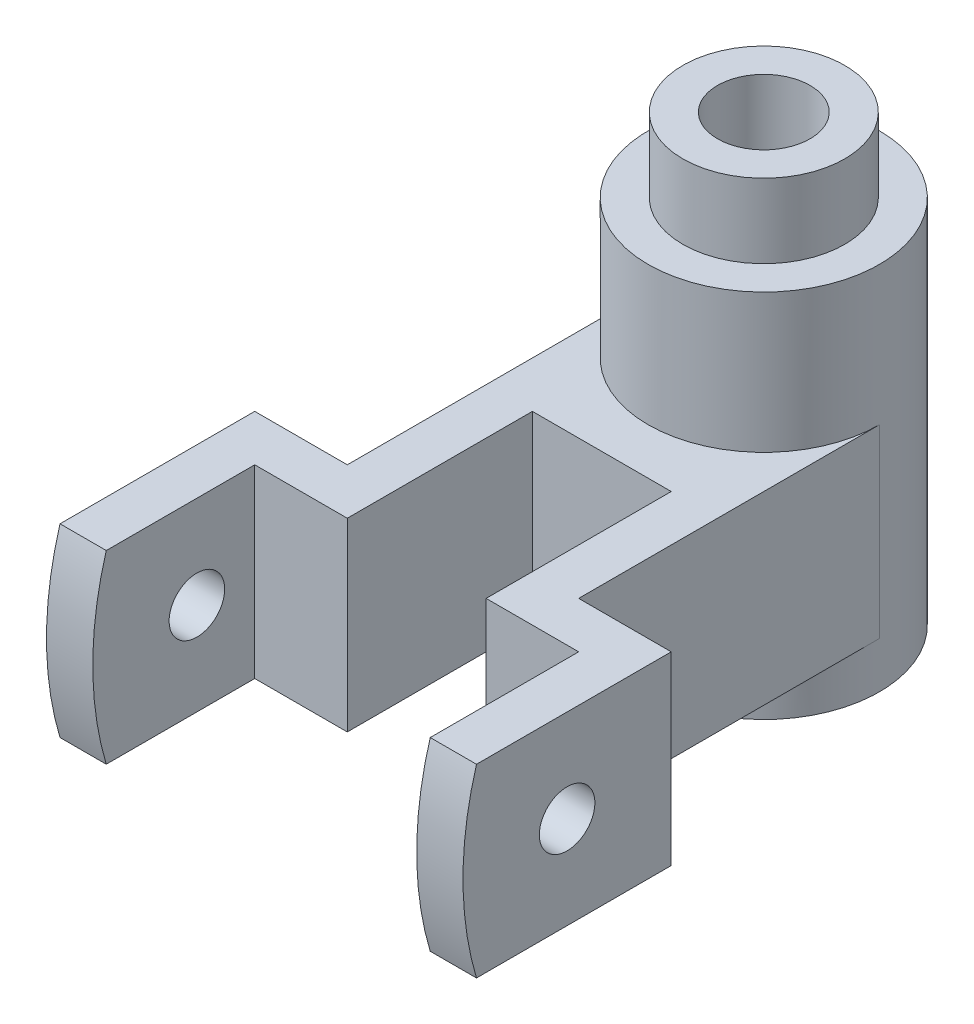
ISO-10303-21;
HEADER;
FILE_DESCRIPTION(('STEP AP214'),'2;1');
FILE_NAME('part.step','',(''),(''),'','','');
FILE_SCHEMA(('AUTOMOTIVE_DESIGN { 1 0 10303 214 1 1 1 1 }'));
ENDSEC;
DATA;
#1=APPLICATION_CONTEXT('core data for automotive mechanical design processes');
#2=APPLICATION_PROTOCOL_DEFINITION('international standard','automotive_design',2000,#1);
#3=PRODUCT_CONTEXT('',#1,'mechanical');
#4=PRODUCT('Part','Part','',(#3));
#5=PRODUCT_RELATED_PRODUCT_CATEGORY('part','',(#4));
#6=PRODUCT_DEFINITION_FORMATION('','',#4);
#7=PRODUCT_DEFINITION_CONTEXT('part definition',#1,'design');
#8=PRODUCT_DEFINITION('design','',#6,#7);
#9=PRODUCT_DEFINITION_SHAPE('','',#8);
#10=(LENGTH_UNIT() NAMED_UNIT(*) SI_UNIT(.MILLI.,.METRE.));
#11=(NAMED_UNIT(*) PLANE_ANGLE_UNIT() SI_UNIT($,.RADIAN.));
#12=(NAMED_UNIT(*) SI_UNIT($,.STERADIAN.) SOLID_ANGLE_UNIT());
#13=UNCERTAINTY_MEASURE_WITH_UNIT(LENGTH_MEASURE(1.E-05),#10,'distance_accuracy_value','');
#14=(GEOMETRIC_REPRESENTATION_CONTEXT(3) GLOBAL_UNCERTAINTY_ASSIGNED_CONTEXT((#13)) GLOBAL_UNIT_ASSIGNED_CONTEXT((#10,
#11,#12)) REPRESENTATION_CONTEXT('',''));
#15=CARTESIAN_POINT('',(0.,0.,0.));
#16=DIRECTION('',(0.,0.,1.));
#17=DIRECTION('',(1.,0.,0.));
#18=AXIS2_PLACEMENT_3D('',#15,#16,#17);
#19=CARTESIAN_POINT('',(45.,0.,75.));
#20=DIRECTION('',(-1.,0.,0.));
#21=DIRECTION('',(0.,0.,1.));
#22=AXIS2_PLACEMENT_3D('',#19,#20,#21);
#23=PLANE('',#22);
#24=CARTESIAN_POINT('',(45.,30.,87.5));
#25=DIRECTION('',(-1.,0.,0.));
#26=DIRECTION('',(0.,0.,1.));
#27=AXIS2_PLACEMENT_3D('',#24,#25,#26);
#28=CIRCLE('',#27,6.);
#29=CARTESIAN_POINT('',(45.,30.,93.5));
#30=VERTEX_POINT('',#29);
#31=EDGE_CURVE('E172',#30,#30,#28,.F.);
#32=ORIENTED_EDGE('',*,*,#31,.F.);
#33=EDGE_LOOP('',(#32));
#34=FACE_BOUND('',#33,.T.);
#35=CARTESIAN_POINT('',(45.,30.,40.));
#36=DIRECTION('',(-1.,0.,0.));
#37=DIRECTION('',(0.,0.,1.));
#38=AXIS2_PLACEMENT_3D('',#35,#36,#37);
#39=CIRCLE('',#38,70.);
#40=CARTESIAN_POINT('',(45.,50.,107.082039324994));
#41=VERTEX_POINT('',#40);
#42=CARTESIAN_POINT('',(45.,10.,107.082039324994));
#43=VERTEX_POINT('',#42);
#44=EDGE_CURVE('E184',#41,#43,#39,.F.);
#45=ORIENTED_EDGE('',*,*,#44,.T.);
#46=DIRECTION('',(0.,0.,-1.));
#47=VECTOR('',#46,1.);
#48=CARTESIAN_POINT('',(45.,10.,75.));
#49=LINE('',#48,#47);
#50=CARTESIAN_POINT('',(45.,10.,65.));
#51=VERTEX_POINT('',#50);
#52=EDGE_CURVE('E176',#43,#51,#49,.T.);
#53=ORIENTED_EDGE('',*,*,#52,.T.);
#54=DIRECTION('',(0.,1.,0.));
#55=VECTOR('',#54,1.);
#56=CARTESIAN_POINT('',(45.,0.,65.));
#57=LINE('',#56,#55);
#58=CARTESIAN_POINT('',(45.,50.,65.));
#59=VERTEX_POINT('',#58);
#60=EDGE_CURVE('E223',#51,#59,#57,.T.);
#61=ORIENTED_EDGE('',*,*,#60,.T.);
#62=DIRECTION('',(0.,0.,-1.));
#63=VECTOR('',#62,1.);
#64=CARTESIAN_POINT('',(45.,50.,75.));
#65=LINE('',#64,#63);
#66=EDGE_CURVE('E221',#41,#59,#65,.T.);
#67=ORIENTED_EDGE('',*,*,#66,.F.);
#68=EDGE_LOOP('',(#45,#53,#61,#67));
#69=FACE_BOUND('',#68,.T.);
#70=ADVANCED_FACE('F39',(#34,#69),#23,.F.);
#71=CARTESIAN_POINT('',(35.,50.,110.));
#72=DIRECTION('',(-1.,0.,0.));
#73=DIRECTION('',(0.,-1.,0.));
#74=AXIS2_PLACEMENT_3D('',#71,#72,#73);
#75=PLANE('',#74);
#76=CARTESIAN_POINT('',(35.,30.,87.5));
#77=DIRECTION('',(1.,0.,0.));
#78=DIRECTION('',(0.,1.,0.));
#79=AXIS2_PLACEMENT_3D('',#76,#77,#78);
#80=CIRCLE('',#79,6.);
#81=CARTESIAN_POINT('',(35.,36.,87.5));
#82=VERTEX_POINT('',#81);
#83=EDGE_CURVE('E177',#82,#82,#80,.T.);
#84=ORIENTED_EDGE('',*,*,#83,.T.);
#85=EDGE_LOOP('',(#84));
#86=FACE_BOUND('',#85,.T.);
#87=DIRECTION('',(0.,0.,-1.));
#88=VECTOR('',#87,1.);
#89=CARTESIAN_POINT('',(35.,10.,110.));
#90=LINE('',#89,#88);
#91=CARTESIAN_POINT('',(35.,10.,107.082039324994));
#92=VERTEX_POINT('',#91);
#93=CARTESIAN_POINT('',(35.,10.,75.));
#94=VERTEX_POINT('',#93);
#95=EDGE_CURVE('E62',#92,#94,#90,.T.);
#96=ORIENTED_EDGE('',*,*,#95,.F.);
#97=CARTESIAN_POINT('',(35.,30.,40.));
#98=DIRECTION('',(1.,0.,0.));
#99=DIRECTION('',(0.,1.,0.));
#100=AXIS2_PLACEMENT_3D('',#97,#98,#99);
#101=CIRCLE('',#100,70.);
#102=CARTESIAN_POINT('',(35.,50.,107.082039324994));
#103=VERTEX_POINT('',#102);
#104=EDGE_CURVE('E166',#103,#92,#101,.T.);
#105=ORIENTED_EDGE('',*,*,#104,.F.);
#106=DIRECTION('',(0.,0.,-1.));
#107=VECTOR('',#106,1.);
#108=CARTESIAN_POINT('',(35.,50.,110.));
#109=LINE('',#108,#107);
#110=CARTESIAN_POINT('',(35.,50.,75.));
#111=VERTEX_POINT('',#110);
#112=EDGE_CURVE('E54',#103,#111,#109,.T.);
#113=ORIENTED_EDGE('',*,*,#112,.T.);
#114=DIRECTION('',(0.,1.,0.));
#115=VECTOR('',#114,1.);
#116=CARTESIAN_POINT('',(35.,50.,75.));
#117=LINE('',#116,#115);
#118=EDGE_CURVE('E180',#94,#111,#117,.T.);
#119=ORIENTED_EDGE('',*,*,#118,.F.);
#120=EDGE_LOOP('',(#96,#105,#113,#119));
#121=FACE_BOUND('',#120,.T.);
#122=ADVANCED_FACE('F179',(#86,#121),#75,.T.);
#123=CARTESIAN_POINT('',(-45.,0.,75.));
#124=DIRECTION('',(-1.,0.,0.));
#125=DIRECTION('',(0.,0.,1.));
#126=AXIS2_PLACEMENT_3D('',#123,#124,#125);
#127=PLANE('',#126);
#128=CARTESIAN_POINT('',(-45.,30.,87.5));
#129=DIRECTION('',(-1.,0.,0.));
#130=DIRECTION('',(0.,0.,1.));
#131=AXIS2_PLACEMENT_3D('',#128,#129,#130);
#132=CIRCLE('',#131,6.);
#133=CARTESIAN_POINT('',(-45.,30.,93.5));
#134=VERTEX_POINT('',#133);
#135=EDGE_CURVE('E191',#134,#134,#132,.T.);
#136=ORIENTED_EDGE('',*,*,#135,.F.);
#137=EDGE_LOOP('',(#136));
#138=FACE_BOUND('',#137,.T.);
#139=DIRECTION('',(0.,0.,-1.));
#140=VECTOR('',#139,1.);
#141=CARTESIAN_POINT('',(-45.,10.,75.));
#142=LINE('',#141,#140);
#143=CARTESIAN_POINT('',(-45.,10.,107.082039324994));
#144=VERTEX_POINT('',#143);
#145=CARTESIAN_POINT('',(-45.,10.,65.));
#146=VERTEX_POINT('',#145);
#147=EDGE_CURVE('E239',#144,#146,#142,.T.);
#148=ORIENTED_EDGE('',*,*,#147,.F.);
#149=CARTESIAN_POINT('',(-45.,30.,40.));
#150=DIRECTION('',(-1.,0.,0.));
#151=DIRECTION('',(0.,0.,1.));
#152=AXIS2_PLACEMENT_3D('',#149,#150,#151);
#153=CIRCLE('',#152,70.);
#154=CARTESIAN_POINT('',(-45.,50.,107.082039324994));
#155=VERTEX_POINT('',#154);
#156=EDGE_CURVE('E201',#144,#155,#153,.T.);
#157=ORIENTED_EDGE('',*,*,#156,.T.);
#158=DIRECTION('',(0.,0.,-1.));
#159=VECTOR('',#158,1.);
#160=CARTESIAN_POINT('',(-45.,50.,75.));
#161=LINE('',#160,#159);
#162=CARTESIAN_POINT('',(-45.,50.,65.));
#163=VERTEX_POINT('',#162);
#164=EDGE_CURVE('E247',#155,#163,#161,.T.);
#165=ORIENTED_EDGE('',*,*,#164,.T.);
#166=DIRECTION('',(0.,1.,0.));
#167=VECTOR('',#166,1.);
#168=CARTESIAN_POINT('',(-45.,0.,65.));
#169=LINE('',#168,#167);
#170=EDGE_CURVE('E234',#146,#163,#169,.T.);
#171=ORIENTED_EDGE('',*,*,#170,.F.);
#172=EDGE_LOOP('',(#148,#157,#165,#171));
#173=FACE_BOUND('',#172,.T.);
#174=ADVANCED_FACE('F359',(#138,#173),#127,.T.);
#175=CARTESIAN_POINT('',(-35.,50.,110.));
#176=DIRECTION('',(-1.,0.,0.));
#177=DIRECTION('',(0.,-1.,0.));
#178=AXIS2_PLACEMENT_3D('',#175,#176,#177);
#179=PLANE('',#178);
#180=CARTESIAN_POINT('',(-35.,30.,87.5));
#181=DIRECTION('',(1.,0.,0.));
#182=DIRECTION('',(0.,1.,0.));
#183=AXIS2_PLACEMENT_3D('',#180,#181,#182);
#184=CIRCLE('',#183,6.);
#185=CARTESIAN_POINT('',(-35.,36.,87.5));
#186=VERTEX_POINT('',#185);
#187=EDGE_CURVE('E182',#186,#186,#184,.T.);
#188=ORIENTED_EDGE('',*,*,#187,.F.);
#189=EDGE_LOOP('',(#188));
#190=FACE_BOUND('',#189,.T.);
#191=CARTESIAN_POINT('',(-35.,30.,40.));
#192=DIRECTION('',(1.,0.,0.));
#193=DIRECTION('',(0.,1.,0.));
#194=AXIS2_PLACEMENT_3D('',#191,#192,#193);
#195=CIRCLE('',#194,70.);
#196=CARTESIAN_POINT('',(-35.,50.,107.082039324994));
#197=VERTEX_POINT('',#196);
#198=CARTESIAN_POINT('',(-35.,10.,107.082039324994));
#199=VERTEX_POINT('',#198);
#200=EDGE_CURVE('E196',#197,#199,#195,.T.);
#201=ORIENTED_EDGE('',*,*,#200,.T.);
#202=DIRECTION('',(0.,0.,-1.));
#203=VECTOR('',#202,1.);
#204=CARTESIAN_POINT('',(-35.,10.,110.));
#205=LINE('',#204,#203);
#206=CARTESIAN_POINT('',(-35.,10.,75.));
#207=VERTEX_POINT('',#206);
#208=EDGE_CURVE('E209',#199,#207,#205,.T.);
#209=ORIENTED_EDGE('',*,*,#208,.T.);
#210=DIRECTION('',(0.,1.,0.));
#211=VECTOR('',#210,1.);
#212=CARTESIAN_POINT('',(-35.,50.,75.));
#213=LINE('',#212,#211);
#214=CARTESIAN_POINT('',(-35.,50.,75.));
#215=VERTEX_POINT('',#214);
#216=EDGE_CURVE('E204',#207,#215,#213,.T.);
#217=ORIENTED_EDGE('',*,*,#216,.T.);
#218=DIRECTION('',(0.,0.,-1.));
#219=VECTOR('',#218,1.);
#220=CARTESIAN_POINT('',(-35.,50.,110.));
#221=LINE('',#220,#219);
#222=EDGE_CURVE('E207',#197,#215,#221,.T.);
#223=ORIENTED_EDGE('',*,*,#222,.F.);
#224=EDGE_LOOP('',(#201,#209,#217,#223));
#225=FACE_BOUND('',#224,.T.);
#226=ADVANCED_FACE('F377',(#190,#225),#179,.F.);
#227=CARTESIAN_POINT('',(0.,10.,0.));
#228=DIRECTION('',(0.,1.,0.));
#229=DIRECTION('',(0.,0.,1.));
#230=AXIS2_PLACEMENT_3D('',#227,#228,#229);
#231=PLANE('',#230);
#232=ORIENTED_EDGE('',*,*,#52,.F.);
#233=DIRECTION('',(-1.,0.,0.));
#234=VECTOR('',#233,1.);
#235=CARTESIAN_POINT('',(70.,10.,107.082039324994));
#236=LINE('',#235,#234);
#237=EDGE_CURVE('E168',#43,#92,#236,.T.);
#238=ORIENTED_EDGE('',*,*,#237,.T.);
#239=ORIENTED_EDGE('',*,*,#95,.T.);
#240=DIRECTION('',(1.,0.,0.));
#241=VECTOR('',#240,1.);
#242=CARTESIAN_POINT('',(0.,10.,75.));
#243=LINE('',#242,#241);
#244=CARTESIAN_POINT('',(15.,10.,75.));
#245=VERTEX_POINT('',#244);
#246=EDGE_CURVE('E212',#245,#94,#243,.T.);
#247=ORIENTED_EDGE('',*,*,#246,.F.);
#248=DIRECTION('',(0.,0.,1.));
#249=VECTOR('',#248,1.);
#250=CARTESIAN_POINT('',(15.,10.,0.));
#251=LINE('',#250,#249);
#252=CARTESIAN_POINT('',(15.,10.,35.));
#253=VERTEX_POINT('',#252);
#254=EDGE_CURVE('E256',#253,#245,#251,.T.);
#255=ORIENTED_EDGE('',*,*,#254,.F.);
#256=DIRECTION('',(-1.,0.,0.));
#257=VECTOR('',#256,1.);
#258=CARTESIAN_POINT('',(0.,10.,35.));
#259=LINE('',#258,#257);
#260=CARTESIAN_POINT('',(-15.,10.,35.));
#261=VERTEX_POINT('',#260);
#262=EDGE_CURVE('E253',#253,#261,#259,.T.);
#263=ORIENTED_EDGE('',*,*,#262,.T.);
#264=DIRECTION('',(0.,0.,1.));
#265=VECTOR('',#264,1.);
#266=CARTESIAN_POINT('',(-15.,10.,0.));
#267=LINE('',#266,#265);
#268=CARTESIAN_POINT('',(-15.,10.,75.));
#269=VERTEX_POINT('',#268);
#270=EDGE_CURVE('E250',#261,#269,#267,.T.);
#271=ORIENTED_EDGE('',*,*,#270,.T.);
#272=DIRECTION('',(1.,0.,0.));
#273=VECTOR('',#272,1.);
#274=CARTESIAN_POINT('',(0.,10.,75.));
#275=LINE('',#274,#273);
#276=EDGE_CURVE('E231',#207,#269,#275,.T.);
#277=ORIENTED_EDGE('',*,*,#276,.F.);
#278=ORIENTED_EDGE('',*,*,#208,.F.);
#279=DIRECTION('',(1.,0.,0.));
#280=VECTOR('',#279,1.);
#281=CARTESIAN_POINT('',(-70.,10.,107.082039324994));
#282=LINE('',#281,#280);
#283=EDGE_CURVE('E188',#144,#199,#282,.T.);
#284=ORIENTED_EDGE('',*,*,#283,.F.);
#285=ORIENTED_EDGE('',*,*,#147,.T.);
#286=DIRECTION('',(1.,0.,0.));
#287=VECTOR('',#286,1.);
#288=CARTESIAN_POINT('',(0.,10.,65.));
#289=LINE('',#288,#287);
#290=CARTESIAN_POINT('',(-25.,10.,65.));
#291=VERTEX_POINT('',#290);
#292=EDGE_CURVE('E230',#146,#291,#289,.T.);
#293=ORIENTED_EDGE('',*,*,#292,.T.);
#294=DIRECTION('',(0.,0.,1.));
#295=VECTOR('',#294,1.);
#296=CARTESIAN_POINT('',(-25.,10.,0.));
#297=LINE('',#296,#295);
#298=CARTESIAN_POINT('',(-25.,10.,0.));
#299=VERTEX_POINT('',#298);
#300=EDGE_CURVE('E264',#299,#291,#297,.T.);
#301=ORIENTED_EDGE('',*,*,#300,.F.);
#302=CARTESIAN_POINT('',(0.,9.99999999999999,0.));
#303=DIRECTION('',(0.,1.,0.));
#304=DIRECTION('',(0.,0.,1.));
#305=AXIS2_PLACEMENT_3D('',#302,#303,#304);
#306=CIRCLE('',#305,25.);
#307=CARTESIAN_POINT('',(25.,10.,0.));
#308=VERTEX_POINT('',#307);
#309=EDGE_CURVE('E300',#299,#308,#306,.T.);
#310=ORIENTED_EDGE('',*,*,#309,.T.);
#311=DIRECTION('',(0.,0.,1.));
#312=VECTOR('',#311,1.);
#313=CARTESIAN_POINT('',(25.,10.,0.));
#314=LINE('',#313,#312);
#315=CARTESIAN_POINT('',(25.,10.,65.));
#316=VERTEX_POINT('',#315);
#317=EDGE_CURVE('E258',#308,#316,#314,.T.);
#318=ORIENTED_EDGE('',*,*,#317,.T.);
#319=DIRECTION('',(1.,0.,0.));
#320=VECTOR('',#319,1.);
#321=CARTESIAN_POINT('',(0.,10.,65.));
#322=LINE('',#321,#320);
#323=EDGE_CURVE('E211',#316,#51,#322,.T.);
#324=ORIENTED_EDGE('',*,*,#323,.T.);
#325=EDGE_LOOP('',(#232,#238,#239,#247,#255,#263,#271,#277,#278,#284,#285,#293,#301,#310,#318,#324));
#326=FACE_BOUND('',#325,.T.);
#327=ADVANCED_FACE('F174',(#326),#231,.F.);
#328=CARTESIAN_POINT('',(0.,50.,0.));
#329=DIRECTION('',(0.,1.,0.));
#330=DIRECTION('',(0.,0.,1.));
#331=AXIS2_PLACEMENT_3D('',#328,#329,#330);
#332=PLANE('',#331);
#333=DIRECTION('',(-1.,0.,0.));
#334=VECTOR('',#333,1.);
#335=CARTESIAN_POINT('',(70.,50.,107.082039324994));
#336=LINE('',#335,#334);
#337=EDGE_CURVE('E171',#41,#103,#336,.T.);
#338=ORIENTED_EDGE('',*,*,#337,.F.);
#339=ORIENTED_EDGE('',*,*,#66,.T.);
#340=DIRECTION('',(1.,0.,0.));
#341=VECTOR('',#340,1.);
#342=CARTESIAN_POINT('',(0.,50.,65.));
#343=LINE('',#342,#341);
#344=CARTESIAN_POINT('',(25.,50.,65.));
#345=VERTEX_POINT('',#344);
#346=EDGE_CURVE('E215',#345,#59,#343,.T.);
#347=ORIENTED_EDGE('',*,*,#346,.F.);
#348=DIRECTION('',(0.,0.,1.));
#349=VECTOR('',#348,1.);
#350=CARTESIAN_POINT('',(25.,50.,0.));
#351=LINE('',#350,#349);
#352=CARTESIAN_POINT('',(25.,50.,0.));
#353=VERTEX_POINT('',#352);
#354=EDGE_CURVE('E274',#353,#345,#351,.T.);
#355=ORIENTED_EDGE('',*,*,#354,.F.);
#356=CARTESIAN_POINT('',(0.,50.,0.));
#357=DIRECTION('',(0.,1.,0.));
#358=DIRECTION('',(0.,0.,1.));
#359=AXIS2_PLACEMENT_3D('',#356,#357,#358);
#360=CIRCLE('',#359,25.);
#361=CARTESIAN_POINT('',(-25.,50.,0.));
#362=VERTEX_POINT('',#361);
#363=EDGE_CURVE('E285',#362,#353,#360,.T.);
#364=ORIENTED_EDGE('',*,*,#363,.F.);
#365=DIRECTION('',(0.,0.,1.));
#366=VECTOR('',#365,1.);
#367=CARTESIAN_POINT('',(-25.,50.,0.));
#368=LINE('',#367,#366);
#369=CARTESIAN_POINT('',(-25.,50.,65.));
#370=VERTEX_POINT('',#369);
#371=EDGE_CURVE('E254',#362,#370,#368,.T.);
#372=ORIENTED_EDGE('',*,*,#371,.T.);
#373=DIRECTION('',(1.,0.,0.));
#374=VECTOR('',#373,1.);
#375=CARTESIAN_POINT('',(0.,50.,65.));
#376=LINE('',#375,#374);
#377=EDGE_CURVE('E242',#163,#370,#376,.T.);
#378=ORIENTED_EDGE('',*,*,#377,.F.);
#379=ORIENTED_EDGE('',*,*,#164,.F.);
#380=DIRECTION('',(1.,0.,0.));
#381=VECTOR('',#380,1.);
#382=CARTESIAN_POINT('',(-70.,50.,107.082039324994));
#383=LINE('',#382,#381);
#384=EDGE_CURVE('E198',#155,#197,#383,.T.);
#385=ORIENTED_EDGE('',*,*,#384,.T.);
#386=ORIENTED_EDGE('',*,*,#222,.T.);
#387=DIRECTION('',(1.,0.,0.));
#388=VECTOR('',#387,1.);
#389=CARTESIAN_POINT('',(0.,50.,75.));
#390=LINE('',#389,#388);
#391=CARTESIAN_POINT('',(-15.,50.,75.));
#392=VERTEX_POINT('',#391);
#393=EDGE_CURVE('E237',#215,#392,#390,.T.);
#394=ORIENTED_EDGE('',*,*,#393,.T.);
#395=DIRECTION('',(0.,0.,1.));
#396=VECTOR('',#395,1.);
#397=CARTESIAN_POINT('',(-15.,50.,0.));
#398=LINE('',#397,#396);
#399=CARTESIAN_POINT('',(-15.,50.,35.));
#400=VERTEX_POINT('',#399);
#401=EDGE_CURVE('E249',#400,#392,#398,.T.);
#402=ORIENTED_EDGE('',*,*,#401,.F.);
#403=DIRECTION('',(-1.,0.,0.));
#404=VECTOR('',#403,1.);
#405=CARTESIAN_POINT('',(0.,50.,35.));
#406=LINE('',#405,#404);
#407=CARTESIAN_POINT('',(15.,50.,35.));
#408=VERTEX_POINT('',#407);
#409=EDGE_CURVE('E270',#408,#400,#406,.T.);
#410=ORIENTED_EDGE('',*,*,#409,.F.);
#411=DIRECTION('',(0.,0.,1.));
#412=VECTOR('',#411,1.);
#413=CARTESIAN_POINT('',(15.,50.,0.));
#414=LINE('',#413,#412);
#415=CARTESIAN_POINT('',(15.,50.,75.));
#416=VERTEX_POINT('',#415);
#417=EDGE_CURVE('E272',#408,#416,#414,.T.);
#418=ORIENTED_EDGE('',*,*,#417,.T.);
#419=DIRECTION('',(1.,0.,0.));
#420=VECTOR('',#419,1.);
#421=CARTESIAN_POINT('',(0.,50.,75.));
#422=LINE('',#421,#420);
#423=EDGE_CURVE('E214',#416,#111,#422,.T.);
#424=ORIENTED_EDGE('',*,*,#423,.T.);
#425=ORIENTED_EDGE('',*,*,#112,.F.);
#426=EDGE_LOOP('',(#338,#339,#347,#355,#364,#372,#378,#379,#385,#386,#394,#402,#410,#418,#424,#425));
#427=FACE_BOUND('',#426,.T.);
#428=ADVANCED_FACE('F339',(#427),#332,.T.);
#429=CARTESIAN_POINT('',(0.,0.,75.));
#430=DIRECTION('',(0.,0.,1.));
#431=DIRECTION('',(1.,0.,0.));
#432=AXIS2_PLACEMENT_3D('',#429,#430,#431);
#433=PLANE('',#432);
#434=ORIENTED_EDGE('',*,*,#393,.F.);
#435=ORIENTED_EDGE('',*,*,#216,.F.);
#436=ORIENTED_EDGE('',*,*,#276,.T.);
#437=DIRECTION('',(0.,1.,0.));
#438=VECTOR('',#437,1.);
#439=CARTESIAN_POINT('',(-15.,0.,75.));
#440=LINE('',#439,#438);
#441=EDGE_CURVE('E233',#269,#392,#440,.T.);
#442=ORIENTED_EDGE('',*,*,#441,.T.);
#443=EDGE_LOOP('',(#434,#435,#436,#442));
#444=FACE_BOUND('',#443,.T.);
#445=ADVANCED_FACE('F350',(#444),#433,.T.);
#446=CARTESIAN_POINT('',(0.,80.,0.));
#447=DIRECTION('',(0.,-1.,0.));
#448=DIRECTION('',(0.,0.,-1.));
#449=AXIS2_PLACEMENT_3D('',#446,#447,#448);
#450=CYLINDRICAL_SURFACE('',#449,25.);
#451=CARTESIAN_POINT('',(0.,0.,0.));
#452=DIRECTION('',(0.,1.,0.));
#453=DIRECTION('',(0.,0.,1.));
#454=AXIS2_PLACEMENT_3D('',#451,#452,#453);
#455=CIRCLE('',#454,25.);
#456=CARTESIAN_POINT('',(0.,0.,25.));
#457=VERTEX_POINT('',#456);
#458=EDGE_CURVE('E311',#457,#457,#455,.T.);
#459=ORIENTED_EDGE('',*,*,#458,.T.);
#460=EDGE_LOOP('',(#459));
#461=FACE_BOUND('',#460,.T.);
#462=CARTESIAN_POINT('',(0.,80.,0.));
#463=DIRECTION('',(0.,1.,0.));
#464=DIRECTION('',(0.,0.,1.));
#465=AXIS2_PLACEMENT_3D('',#462,#463,#464);
#466=CIRCLE('',#465,25.);
#467=CARTESIAN_POINT('',(0.,80.,25.));
#468=VERTEX_POINT('',#467);
#469=EDGE_CURVE('E316',#468,#468,#466,.T.);
#470=ORIENTED_EDGE('',*,*,#469,.F.);
#471=EDGE_LOOP('',(#470));
#472=FACE_BOUND('',#471,.T.);
#473=ORIENTED_EDGE('',*,*,#309,.F.);
#474=DIRECTION('',(0.,1.,0.));
#475=VECTOR('',#474,1.);
#476=CARTESIAN_POINT('',(-25.,10.,0.));
#477=LINE('',#476,#475);
#478=EDGE_CURVE('E286',#299,#362,#477,.T.);
#479=ORIENTED_EDGE('',*,*,#478,.T.);
#480=ORIENTED_EDGE('',*,*,#363,.T.);
#481=DIRECTION('',(0.,1.,0.));
#482=VECTOR('',#481,1.);
#483=CARTESIAN_POINT('',(25.,10.,0.));
#484=LINE('',#483,#482);
#485=EDGE_CURVE('E289',#308,#353,#484,.T.);
#486=ORIENTED_EDGE('',*,*,#485,.F.);
#487=EDGE_LOOP('',(#473,#479,#480,#486));
#488=FACE_BOUND('',#487,.T.);
#489=ADVANCED_FACE('F41',(#461,#472,#488),#450,.T.);
#490=CARTESIAN_POINT('',(0.,-48.,0.));
#491=DIRECTION('',(0.,1.,0.));
#492=DIRECTION('',(0.,0.,1.));
#493=AXIS2_PLACEMENT_3D('',#490,#491,#492);
#494=CYLINDRICAL_SURFACE('',#493,10.);
#495=CARTESIAN_POINT('',(0.,0.,0.));
#496=DIRECTION('',(0.,1.,0.));
#497=DIRECTION('',(0.,0.,1.));
#498=AXIS2_PLACEMENT_3D('',#495,#496,#497);
#499=CIRCLE('',#498,10.);
#500=CARTESIAN_POINT('',(0.,0.,10.));
#501=VERTEX_POINT('',#500);
#502=EDGE_CURVE('E305',#501,#501,#499,.T.);
#503=ORIENTED_EDGE('',*,*,#502,.F.);
#504=EDGE_LOOP('',(#503));
#505=FACE_BOUND('',#504,.T.);
#506=CARTESIAN_POINT('',(0.,96.,0.));
#507=DIRECTION('',(0.,1.,0.));
#508=DIRECTION('',(0.,0.,1.));
#509=AXIS2_PLACEMENT_3D('',#506,#507,#508);
#510=CIRCLE('',#509,10.);
#511=CARTESIAN_POINT('',(0.,96.,10.));
#512=VERTEX_POINT('',#511);
#513=EDGE_CURVE('E302',#512,#512,#510,.T.);
#514=ORIENTED_EDGE('',*,*,#513,.T.);
#515=EDGE_LOOP('',(#514));
#516=FACE_BOUND('',#515,.T.);
#517=CARTESIAN_POINT('',(0.,10.,0.));
#518=DIRECTION('',(0.,1.,0.));
#519=DIRECTION('',(0.,0.,1.));
#520=AXIS2_PLACEMENT_3D('',#517,#518,#519);
#521=CIRCLE('',#520,10.);
#522=CARTESIAN_POINT('',(10.,10.,0.));
#523=VERTEX_POINT('',#522);
#524=CARTESIAN_POINT('',(-10.,10.,0.));
#525=VERTEX_POINT('',#524);
#526=EDGE_CURVE('E11',#523,#525,#521,.F.);
#527=ORIENTED_EDGE('',*,*,#526,.F.);
#528=DIRECTION('',(0.,1.,0.));
#529=VECTOR('',#528,1.);
#530=CARTESIAN_POINT('',(10.,-48.,0.));
#531=LINE('',#530,#529);
#532=CARTESIAN_POINT('',(10.,50.,0.));
#533=VERTEX_POINT('',#532);
#534=EDGE_CURVE('E47',#533,#523,#531,.F.);
#535=ORIENTED_EDGE('',*,*,#534,.F.);
#536=CARTESIAN_POINT('',(0.,50.,0.));
#537=DIRECTION('',(0.,1.,0.));
#538=DIRECTION('',(0.,0.,1.));
#539=AXIS2_PLACEMENT_3D('',#536,#537,#538);
#540=CIRCLE('',#539,10.);
#541=CARTESIAN_POINT('',(-10.,50.,0.));
#542=VERTEX_POINT('',#541);
#543=EDGE_CURVE('E315',#533,#542,#540,.F.);
#544=ORIENTED_EDGE('',*,*,#543,.T.);
#545=DIRECTION('',(0.,1.,0.));
#546=VECTOR('',#545,1.);
#547=CARTESIAN_POINT('',(-10.,-48.,0.));
#548=LINE('',#547,#546);
#549=EDGE_CURVE('E323',#525,#542,#548,.T.);
#550=ORIENTED_EDGE('',*,*,#549,.F.);
#551=EDGE_LOOP('',(#527,#535,#544,#550));
#552=FACE_BOUND('',#551,.T.);
#553=ADVANCED_FACE('F334',(#505,#516,#552),#494,.F.);
#554=CARTESIAN_POINT('',(0.,80.,0.));
#555=DIRECTION('',(0.,1.,0.));
#556=DIRECTION('',(0.,0.,1.));
#557=AXIS2_PLACEMENT_3D('',#554,#555,#556);
#558=PLANE('',#557);
#559=CARTESIAN_POINT('',(0.,80.,0.));
#560=DIRECTION('',(0.,1.,0.));
#561=DIRECTION('',(0.,0.,1.));
#562=AXIS2_PLACEMENT_3D('',#559,#560,#561);
#563=CIRCLE('',#562,17.5);
#564=CARTESIAN_POINT('',(0.,80.,17.5));
#565=VERTEX_POINT('',#564);
#566=EDGE_CURVE('E312',#565,#565,#563,.T.);
#567=ORIENTED_EDGE('',*,*,#566,.F.);
#568=EDGE_LOOP('',(#567));
#569=FACE_BOUND('',#568,.T.);
#570=ORIENTED_EDGE('',*,*,#469,.T.);
#571=EDGE_LOOP('',(#570));
#572=FACE_BOUND('',#571,.T.);
#573=ADVANCED_FACE('F540',(#569,#572),#558,.T.);
#574=CARTESIAN_POINT('',(0.,0.,0.));
#575=DIRECTION('',(0.,1.,0.));
#576=DIRECTION('',(0.,0.,1.));
#577=AXIS2_PLACEMENT_3D('',#574,#575,#576);
#578=PLANE('',#577);
#579=ORIENTED_EDGE('',*,*,#502,.T.);
#580=EDGE_LOOP('',(#579));
#581=FACE_BOUND('',#580,.T.);
#582=ORIENTED_EDGE('',*,*,#458,.F.);
#583=EDGE_LOOP('',(#582));
#584=FACE_BOUND('',#583,.T.);
#585=ADVANCED_FACE('F568',(#581,#584),#578,.F.);
#586=CARTESIAN_POINT('',(0.,96.,0.));
#587=DIRECTION('',(0.,-1.,0.));
#588=DIRECTION('',(0.,0.,-1.));
#589=AXIS2_PLACEMENT_3D('',#586,#587,#588);
#590=CYLINDRICAL_SURFACE('',#589,17.5);
#591=CARTESIAN_POINT('',(0.,96.,0.));
#592=DIRECTION('',(0.,1.,0.));
#593=DIRECTION('',(0.,0.,1.));
#594=AXIS2_PLACEMENT_3D('',#591,#592,#593);
#595=CIRCLE('',#594,17.5);
#596=CARTESIAN_POINT('',(0.,96.,17.5));
#597=VERTEX_POINT('',#596);
#598=EDGE_CURVE('E308',#597,#597,#595,.T.);
#599=ORIENTED_EDGE('',*,*,#598,.F.);
#600=EDGE_LOOP('',(#599));
#601=FACE_BOUND('',#600,.T.);
#602=ORIENTED_EDGE('',*,*,#566,.T.);
#603=EDGE_LOOP('',(#602));
#604=FACE_BOUND('',#603,.T.);
#605=ADVANCED_FACE('F560',(#601,#604),#590,.T.);
#606=CARTESIAN_POINT('',(0.,96.,0.));
#607=DIRECTION('',(0.,1.,0.));
#608=DIRECTION('',(0.,0.,1.));
#609=AXIS2_PLACEMENT_3D('',#606,#607,#608);
#610=PLANE('',#609);
#611=ORIENTED_EDGE('',*,*,#513,.F.);
#612=EDGE_LOOP('',(#611));
#613=FACE_BOUND('',#612,.T.);
#614=ORIENTED_EDGE('',*,*,#598,.T.);
#615=EDGE_LOOP('',(#614));
#616=FACE_BOUND('',#615,.T.);
#617=ADVANCED_FACE('F346',(#613,#616),#610,.T.);
#618=DIRECTION('',(1.,0.,0.));
#619=VECTOR('',#618,1.);
#620=CARTESIAN_POINT('',(0.,10.,0.));
#621=LINE('',#620,#619);
#622=EDGE_CURVE('E261',#525,#523,#621,.T.);
#623=ORIENTED_EDGE('',*,*,#622,.T.);
#624=ORIENTED_EDGE('',*,*,#526,.T.);
#625=EDGE_LOOP('',(#623,#624));
#626=FACE_BOUND('',#625,.T.);
#627=ADVANCED_FACE('F333',(#626),#231,.F.);
#628=ORIENTED_EDGE('',*,*,#543,.F.);
#629=DIRECTION('',(1.,0.,0.));
#630=VECTOR('',#629,1.);
#631=CARTESIAN_POINT('',(0.,50.,0.));
#632=LINE('',#631,#630);
#633=EDGE_CURVE('E277',#542,#533,#632,.T.);
#634=ORIENTED_EDGE('',*,*,#633,.F.);
#635=EDGE_LOOP('',(#628,#634));
#636=FACE_BOUND('',#635,.T.);
#637=ADVANCED_FACE('F336',(#636),#332,.T.);
#638=CARTESIAN_POINT('',(0.,10.,0.));
#639=DIRECTION('',(0.,0.,1.));
#640=DIRECTION('',(1.,0.,0.));
#641=AXIS2_PLACEMENT_3D('',#638,#639,#640);
#642=PLANE('',#641);
#643=ORIENTED_EDGE('',*,*,#633,.T.);
#644=ORIENTED_EDGE('',*,*,#534,.T.);
#645=ORIENTED_EDGE('',*,*,#622,.F.);
#646=ORIENTED_EDGE('',*,*,#549,.T.);
#647=EDGE_LOOP('',(#643,#644,#645,#646));
#648=FACE_BOUND('',#647,.T.);
#649=ADVANCED_FACE('F328',(#648),#642,.F.);
#650=CARTESIAN_POINT('',(-15.,10.,0.));
#651=DIRECTION('',(-1.,0.,0.));
#652=DIRECTION('',(0.,0.,1.));
#653=AXIS2_PLACEMENT_3D('',#650,#651,#652);
#654=PLANE('',#653);
#655=ORIENTED_EDGE('',*,*,#401,.T.);
#656=ORIENTED_EDGE('',*,*,#441,.F.);
#657=ORIENTED_EDGE('',*,*,#270,.F.);
#658=DIRECTION('',(0.,1.,0.));
#659=VECTOR('',#658,1.);
#660=CARTESIAN_POINT('',(-15.,10.,35.));
#661=LINE('',#660,#659);
#662=EDGE_CURVE('E267',#261,#400,#661,.T.);
#663=ORIENTED_EDGE('',*,*,#662,.T.);
#664=EDGE_LOOP('',(#655,#656,#657,#663));
#665=FACE_BOUND('',#664,.T.);
#666=ADVANCED_FACE('F344',(#665),#654,.F.);
#667=CARTESIAN_POINT('',(-25.,10.,0.));
#668=DIRECTION('',(-1.,0.,0.));
#669=DIRECTION('',(0.,0.,1.));
#670=AXIS2_PLACEMENT_3D('',#667,#668,#669);
#671=PLANE('',#670);
#672=ORIENTED_EDGE('',*,*,#371,.F.);
#673=ORIENTED_EDGE('',*,*,#478,.F.);
#674=ORIENTED_EDGE('',*,*,#300,.T.);
#675=DIRECTION('',(0.,1.,0.));
#676=VECTOR('',#675,1.);
#677=CARTESIAN_POINT('',(-25.,10.,65.));
#678=LINE('',#677,#676);
#679=EDGE_CURVE('E282',#291,#370,#678,.T.);
#680=ORIENTED_EDGE('',*,*,#679,.T.);
#681=EDGE_LOOP('',(#672,#673,#674,#680));
#682=FACE_BOUND('',#681,.T.);
#683=ADVANCED_FACE('F434',(#682),#671,.T.);
#684=CARTESIAN_POINT('',(25.,10.,0.));
#685=DIRECTION('',(-1.,0.,0.));
#686=DIRECTION('',(0.,0.,1.));
#687=AXIS2_PLACEMENT_3D('',#684,#685,#686);
#688=PLANE('',#687);
#689=ORIENTED_EDGE('',*,*,#354,.T.);
#690=DIRECTION('',(0.,1.,0.));
#691=VECTOR('',#690,1.);
#692=CARTESIAN_POINT('',(25.,10.,65.));
#693=LINE('',#692,#691);
#694=EDGE_CURVE('E292',#316,#345,#693,.T.);
#695=ORIENTED_EDGE('',*,*,#694,.F.);
#696=ORIENTED_EDGE('',*,*,#317,.F.);
#697=ORIENTED_EDGE('',*,*,#485,.T.);
#698=EDGE_LOOP('',(#689,#695,#696,#697));
#699=FACE_BOUND('',#698,.T.);
#700=ADVANCED_FACE('F440',(#699),#688,.F.);
#701=CARTESIAN_POINT('',(15.,10.,0.));
#702=DIRECTION('',(-1.,0.,0.));
#703=DIRECTION('',(0.,0.,1.));
#704=AXIS2_PLACEMENT_3D('',#701,#702,#703);
#705=PLANE('',#704);
#706=ORIENTED_EDGE('',*,*,#417,.F.);
#707=DIRECTION('',(0.,1.,0.));
#708=VECTOR('',#707,1.);
#709=CARTESIAN_POINT('',(15.,10.,35.));
#710=LINE('',#709,#708);
#711=EDGE_CURVE('E294',#253,#408,#710,.T.);
#712=ORIENTED_EDGE('',*,*,#711,.F.);
#713=ORIENTED_EDGE('',*,*,#254,.T.);
#714=DIRECTION('',(0.,-1.,0.));
#715=VECTOR('',#714,1.);
#716=CARTESIAN_POINT('',(15.,0.,75.));
#717=LINE('',#716,#715);
#718=EDGE_CURVE('E218',#416,#245,#717,.T.);
#719=ORIENTED_EDGE('',*,*,#718,.F.);
#720=EDGE_LOOP('',(#706,#712,#713,#719));
#721=FACE_BOUND('',#720,.T.);
#722=ADVANCED_FACE('F410',(#721),#705,.T.);
#723=CARTESIAN_POINT('',(0.,10.,35.));
#724=DIRECTION('',(0.,0.,-1.));
#725=DIRECTION('',(-1.,0.,0.));
#726=AXIS2_PLACEMENT_3D('',#723,#724,#725);
#727=PLANE('',#726);
#728=ORIENTED_EDGE('',*,*,#409,.T.);
#729=ORIENTED_EDGE('',*,*,#662,.F.);
#730=ORIENTED_EDGE('',*,*,#262,.F.);
#731=ORIENTED_EDGE('',*,*,#711,.T.);
#732=EDGE_LOOP('',(#728,#729,#730,#731));
#733=FACE_BOUND('',#732,.T.);
#734=ADVANCED_FACE('F374',(#733),#727,.F.);
#735=CARTESIAN_POINT('',(0.,0.,65.));
#736=DIRECTION('',(0.,0.,1.));
#737=DIRECTION('',(1.,0.,0.));
#738=AXIS2_PLACEMENT_3D('',#735,#736,#737);
#739=PLANE('',#738);
#740=ORIENTED_EDGE('',*,*,#679,.F.);
#741=ORIENTED_EDGE('',*,*,#292,.F.);
#742=ORIENTED_EDGE('',*,*,#170,.T.);
#743=ORIENTED_EDGE('',*,*,#377,.T.);
#744=EDGE_LOOP('',(#740,#741,#742,#743));
#745=FACE_BOUND('',#744,.T.);
#746=ADVANCED_FACE('F371',(#745),#739,.F.);
#747=CARTESIAN_POINT('',(0.,0.,65.));
#748=DIRECTION('',(0.,0.,1.));
#749=DIRECTION('',(1.,0.,0.));
#750=AXIS2_PLACEMENT_3D('',#747,#748,#749);
#751=PLANE('',#750);
#752=ORIENTED_EDGE('',*,*,#323,.F.);
#753=ORIENTED_EDGE('',*,*,#694,.T.);
#754=ORIENTED_EDGE('',*,*,#346,.T.);
#755=ORIENTED_EDGE('',*,*,#60,.F.);
#756=EDGE_LOOP('',(#752,#753,#754,#755));
#757=FACE_BOUND('',#756,.T.);
#758=ADVANCED_FACE('F366',(#757),#751,.F.);
#759=CARTESIAN_POINT('',(0.,0.,75.));
#760=DIRECTION('',(0.,0.,1.));
#761=DIRECTION('',(1.,0.,0.));
#762=AXIS2_PLACEMENT_3D('',#759,#760,#761);
#763=PLANE('',#762);
#764=ORIENTED_EDGE('',*,*,#118,.T.);
#765=ORIENTED_EDGE('',*,*,#423,.F.);
#766=ORIENTED_EDGE('',*,*,#718,.T.);
#767=ORIENTED_EDGE('',*,*,#246,.T.);
#768=EDGE_LOOP('',(#764,#765,#766,#767));
#769=FACE_BOUND('',#768,.T.);
#770=ADVANCED_FACE('F392',(#769),#763,.T.);
#771=CARTESIAN_POINT('',(-70.,30.,40.));
#772=DIRECTION('',(1.,0.,0.));
#773=DIRECTION('',(0.,1.,0.));
#774=AXIS2_PLACEMENT_3D('',#771,#772,#773);
#775=CYLINDRICAL_SURFACE('',#774,70.);
#776=ORIENTED_EDGE('',*,*,#156,.F.);
#777=ORIENTED_EDGE('',*,*,#283,.T.);
#778=ORIENTED_EDGE('',*,*,#200,.F.);
#779=ORIENTED_EDGE('',*,*,#384,.F.);
#780=EDGE_LOOP('',(#776,#777,#778,#779));
#781=FACE_BOUND('',#780,.T.);
#782=ADVANCED_FACE('F390',(#781),#775,.T.);
#783=CARTESIAN_POINT('',(-70.,30.,87.5));
#784=DIRECTION('',(1.,0.,0.));
#785=DIRECTION('',(0.,1.,0.));
#786=AXIS2_PLACEMENT_3D('',#783,#784,#785);
#787=CYLINDRICAL_SURFACE('',#786,6.);
#788=ORIENTED_EDGE('',*,*,#135,.T.);
#789=EDGE_LOOP('',(#788));
#790=FACE_BOUND('',#789,.T.);
#791=ORIENTED_EDGE('',*,*,#187,.T.);
#792=EDGE_LOOP('',(#791));
#793=FACE_BOUND('',#792,.T.);
#794=ADVANCED_FACE('F400',(#790,#793),#787,.F.);
#795=CARTESIAN_POINT('',(70.,30.,40.));
#796=DIRECTION('',(-1.,0.,0.));
#797=DIRECTION('',(0.,-1.,0.));
#798=AXIS2_PLACEMENT_3D('',#795,#796,#797);
#799=CYLINDRICAL_SURFACE('',#798,70.);
#800=ORIENTED_EDGE('',*,*,#337,.T.);
#801=ORIENTED_EDGE('',*,*,#104,.T.);
#802=ORIENTED_EDGE('',*,*,#237,.F.);
#803=ORIENTED_EDGE('',*,*,#44,.F.);
#804=EDGE_LOOP('',(#800,#801,#802,#803));
#805=FACE_BOUND('',#804,.T.);
#806=ADVANCED_FACE('F167',(#805),#799,.T.);
#807=CARTESIAN_POINT('',(70.,30.,87.5));
#808=DIRECTION('',(-1.,0.,0.));
#809=DIRECTION('',(0.,-1.,0.));
#810=AXIS2_PLACEMENT_3D('',#807,#808,#809);
#811=CYLINDRICAL_SURFACE('',#810,6.);
#812=ORIENTED_EDGE('',*,*,#83,.F.);
#813=EDGE_LOOP('',(#812));
#814=FACE_BOUND('',#813,.T.);
#815=ORIENTED_EDGE('',*,*,#31,.T.);
#816=EDGE_LOOP('',(#815));
#817=FACE_BOUND('',#816,.T.);
#818=ADVANCED_FACE('F451',(#814,#817),#811,.F.);
#819=CLOSED_SHELL('',(#70,#122,#174,#226,#327,#428,#445,#489,#553,#573,#585,#605,#617,#627,#637,
#649,#666,#683,#700,#722,#734,#746,#758,#770,#782,#794,#806,#818));
#820=MANIFOLD_SOLID_BREP('B2',#819);
#821=ADVANCED_BREP_SHAPE_REPRESENTATION('',(#18,#820),#14);
#822=SHAPE_DEFINITION_REPRESENTATION(#9,#821);
ENDSEC;
END-ISO-10303-21;
